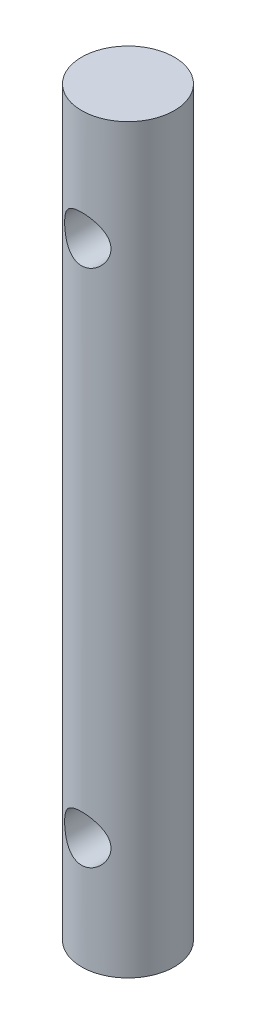
ISO-10303-21;
HEADER;
FILE_DESCRIPTION(('STEP AP214'),'2;1');
FILE_NAME('part.step','',(''),(''),'','','');
FILE_SCHEMA(('AUTOMOTIVE_DESIGN { 1 0 10303 214 1 1 1 1 }'));
ENDSEC;
DATA;
#1=APPLICATION_CONTEXT('core data for automotive mechanical design processes');
#2=APPLICATION_PROTOCOL_DEFINITION('international standard','automotive_design',2000,#1);
#3=PRODUCT_CONTEXT('',#1,'mechanical');
#4=PRODUCT('Part','Part','',(#3));
#5=PRODUCT_RELATED_PRODUCT_CATEGORY('part','',(#4));
#6=PRODUCT_DEFINITION_FORMATION('','',#4);
#7=PRODUCT_DEFINITION_CONTEXT('part definition',#1,'design');
#8=PRODUCT_DEFINITION('design','',#6,#7);
#9=PRODUCT_DEFINITION_SHAPE('','',#8);
#10=(LENGTH_UNIT() NAMED_UNIT(*) SI_UNIT(.MILLI.,.METRE.));
#11=(NAMED_UNIT(*) PLANE_ANGLE_UNIT() SI_UNIT($,.RADIAN.));
#12=(NAMED_UNIT(*) SI_UNIT($,.STERADIAN.) SOLID_ANGLE_UNIT());
#13=UNCERTAINTY_MEASURE_WITH_UNIT(LENGTH_MEASURE(1.E-05),#10,'distance_accuracy_value','');
#14=(GEOMETRIC_REPRESENTATION_CONTEXT(3) GLOBAL_UNCERTAINTY_ASSIGNED_CONTEXT((#13)) GLOBAL_UNIT_ASSIGNED_CONTEXT((#10,
#11,#12)) REPRESENTATION_CONTEXT('',''));
#15=CARTESIAN_POINT('',(0.,0.,0.));
#16=DIRECTION('',(0.,0.,1.));
#17=DIRECTION('',(1.,0.,0.));
#18=AXIS2_PLACEMENT_3D('',#15,#16,#17);
#19=CARTESIAN_POINT('',(0.,50.8,0.));
#20=DIRECTION('',(0.,-1.,0.));
#21=DIRECTION('',(0.,0.,-1.));
#22=AXIS2_PLACEMENT_3D('',#19,#20,#21);
#23=CYLINDRICAL_SURFACE('',#22,3.175);
#24=CARTESIAN_POINT('',(0.,50.8,0.));
#25=DIRECTION('',(0.,1.,0.));
#26=DIRECTION('',(0.,0.,1.));
#27=AXIS2_PLACEMENT_3D('',#24,#25,#26);
#28=CIRCLE('',#27,3.175);
#29=CARTESIAN_POINT('',(0.,50.8,3.175));
#30=VERTEX_POINT('',#29);
#31=EDGE_CURVE('E10',#30,#30,#28,.T.);
#32=ORIENTED_EDGE('',*,*,#31,.F.);
#33=EDGE_LOOP('',(#32));
#34=FACE_BOUND('',#33,.T.);
#35=CARTESIAN_POINT('',(0.,0.,0.));
#36=DIRECTION('',(0.,1.,0.));
#37=DIRECTION('',(0.,0.,1.));
#38=AXIS2_PLACEMENT_3D('',#35,#36,#37);
#39=CIRCLE('',#38,3.175);
#40=CARTESIAN_POINT('',(0.,0.,3.175));
#41=VERTEX_POINT('',#40);
#42=EDGE_CURVE('E42',#41,#41,#39,.T.);
#43=ORIENTED_EDGE('',*,*,#42,.T.);
#44=EDGE_LOOP('',(#43));
#45=FACE_BOUND('',#44,.T.);
#46=CARTESIAN_POINT('',(-1.5875,43.18,2.74963065701559));
#47=CARTESIAN_POINT('',(-1.58749422638082,43.09727885449,2.74963786381429));
#48=CARTESIAN_POINT('',(-1.58099120353898,43.014453259204,2.75342034385563));
#49=CARTESIAN_POINT('',(-1.55531059571316,42.851344217325,2.76800256742633));
#50=CARTESIAN_POINT('',(-1.53610637747976,42.7710664848686,2.77881705563201));
#51=CARTESIAN_POINT('',(-1.48605866856095,42.615720482854,2.8058958773607));
#52=CARTESIAN_POINT('',(-1.4552770495838,42.5406269891982,2.82213119013788));
#53=CARTESIAN_POINT('',(-1.38313719653499,42.3966890793302,2.85817730396762));
#54=CARTESIAN_POINT('',(-1.34177839028179,42.3278450014583,2.87798829843252));
#55=CARTESIAN_POINT('',(-1.24565813309277,42.192089655915,2.92095029628688));
#56=CARTESIAN_POINT('',(-1.19007260737824,42.1258061221182,2.94424201025251));
#57=CARTESIAN_POINT('',(-1.06879041958797,42.0030141834043,2.99040522672308));
#58=CARTESIAN_POINT('',(-1.00308874467939,41.9465106543987,3.01327651457109));
#59=CARTESIAN_POINT('',(-0.858027181920595,41.8411546475531,3.05786594662806));
#60=CARTESIAN_POINT('',(-0.778045162557466,41.793074643523,3.07940243938849));
#61=CARTESIAN_POINT('',(-0.609849279726717,41.7113388954724,3.11706825308002));
#62=CARTESIAN_POINT('',(-0.521640654294325,41.6776740483822,3.1332009850419));
#63=CARTESIAN_POINT('',(-0.346146348482492,41.6282113501845,3.15722732225227));
#64=CARTESIAN_POINT('',(-0.259241592401001,41.6113126269106,3.16562549850666));
#65=CARTESIAN_POINT('',(-0.0834558730578378,41.5922362866034,3.17512039355631));
#66=CARTESIAN_POINT('',(0.00542386177693117,41.5900497623368,3.17622153020536));
#67=CARTESIAN_POINT('',(0.1743591325227,41.6000353449279,3.17123733792365));
#68=CARTESIAN_POINT('',(0.254509903693154,41.6109753496399,3.16576862228805));
#69=CARTESIAN_POINT('',(0.411660612920334,41.6446983396986,3.14919114349849));
#70=CARTESIAN_POINT('',(0.488660314736604,41.6674822112498,3.138081958304));
#71=CARTESIAN_POINT('',(0.638666159116664,41.7243935736676,3.11104888469151));
#72=CARTESIAN_POINT('',(0.711602309830344,41.7586736471606,3.09506050927604));
#73=CARTESIAN_POINT('',(0.850863172402408,41.8373931732199,3.05971013003866));
#74=CARTESIAN_POINT('',(0.917185505031348,41.8818362629925,3.04034691900006));
#75=CARTESIAN_POINT('',(1.04802568667588,41.9844463705587,2.99790476108776));
#76=CARTESIAN_POINT('',(1.11178034410911,42.0435135574675,2.97464759397103));
#77=CARTESIAN_POINT('',(1.22889068784772,42.1712861883266,2.92821265681564));
#78=CARTESIAN_POINT('',(1.28223837337409,42.2399989784851,2.90503496121686));
#79=CARTESIAN_POINT('',(1.38033971874451,42.3904540054732,2.85978847796819));
#80=CARTESIAN_POINT('',(1.42433248752765,42.4727465615985,2.83788357985248));
#81=CARTESIAN_POINT('',(1.49751909188945,42.6449135532824,2.79996027317239));
#82=CARTESIAN_POINT('',(1.52672836990979,42.7347799624154,2.78393572698132));
#83=CARTESIAN_POINT('',(1.56714858500225,42.9120530366614,2.76137109359542));
#84=CARTESIAN_POINT('',(1.57960238136546,42.9990902764816,2.75418003659488));
#85=CARTESIAN_POINT('',(1.58990815274564,43.1742871296575,2.74824696986555));
#86=CARTESIAN_POINT('',(1.5877704422376,43.2624459062277,2.74949899186782));
#87=CARTESIAN_POINT('',(1.57009471880855,43.4271005957437,2.75962009258178));
#88=CARTESIAN_POINT('',(1.55604815903104,43.5038173786338,2.76764095166813));
#89=CARTESIAN_POINT('',(1.517167851854,43.6536588607051,2.78914259212754));
#90=CARTESIAN_POINT('',(1.49233061106499,43.7267823880602,2.80262514157991));
#91=CARTESIAN_POINT('',(1.43136554691026,43.871215487808,2.83426252551455));
#92=CARTESIAN_POINT('',(1.3947680761122,43.942284189255,2.85260483648363));
#93=CARTESIAN_POINT('',(1.31173071412509,44.0776824685681,2.89172839701884));
#94=CARTESIAN_POINT('',(1.2652857668774,44.1420085590773,2.91251089701297));
#95=CARTESIAN_POINT('',(1.15702900292818,44.2705787934436,2.95732197549433));
#96=CARTESIAN_POINT('',(1.09401811980001,44.3337904767643,2.98142950757434));
#97=CARTESIAN_POINT('',(0.957904636444783,44.4490669278148,3.02790598027404));
#98=CARTESIAN_POINT('',(0.884798641015364,44.501127930241,3.05027433199738));
#99=CARTESIAN_POINT('',(0.727924888062026,44.5937857899458,3.09151911684394));
#100=CARTESIAN_POINT('',(0.643926667398903,44.6340438251598,3.11028781154346));
#101=CARTESIAN_POINT('',(0.469141753867716,44.6994564223736,3.1413982599789));
#102=CARTESIAN_POINT('',(0.37836110096008,44.724624246544,3.15374565586242));
#103=CARTESIAN_POINT('',(0.20158024569954,44.7569725956273,3.16972169238739));
#104=CARTESIAN_POINT('',(0.115905667112603,44.7655916279533,3.17404635554253));
#105=CARTESIAN_POINT('',(-0.0557625026975328,44.7688386839089,3.17566881970521));
#106=CARTESIAN_POINT('',(-0.141755971718447,44.7634716052812,3.17296908056188));
#107=CARTESIAN_POINT('',(-0.305654062803469,44.7398514542119,3.16125175530202));
#108=CARTESIAN_POINT('',(-0.383718304525379,44.7224708018034,3.15266220285434));
#109=CARTESIAN_POINT('',(-0.535695449091491,44.6764933886065,3.13042448690684));
#110=CARTESIAN_POINT('',(-0.609607754866868,44.6478950193516,3.11677559798313));
#111=CARTESIAN_POINT('',(-0.754734657413752,44.5790208046865,3.08492415062641));
#112=CARTESIAN_POINT('',(-0.825698664036321,44.5382978244076,3.06655179803093));
#113=CARTESIAN_POINT('',(-0.960079743879763,44.4468917847613,3.02717411362649));
#114=CARTESIAN_POINT('',(-1.02349332927116,44.3962041507789,3.00616757411397));
#115=CARTESIAN_POINT('',(-1.14762598159906,44.2804595418015,2.96114168734771));
#116=CARTESIAN_POINT('',(-1.20744882420609,44.21447455113,2.93703055931071));
#117=CARTESIAN_POINT('',(-1.31550296873904,44.0730469802065,2.89025133408528));
#118=CARTESIAN_POINT('',(-1.36372401564096,43.9975961218725,2.86758452646961));
#119=CARTESIAN_POINT('',(-1.44848433915972,43.8362143235527,2.82574373421554));
#120=CARTESIAN_POINT('',(-1.48460629221299,43.7500275443331,2.80670276631829));
#121=CARTESIAN_POINT('',(-1.54126995134143,43.5715848081106,2.77600023171258));
#122=CARTESIAN_POINT('',(-1.56186376599086,43.4793502888511,2.76431400634477));
#123=CARTESIAN_POINT('',(-1.57855762498476,43.3517589979025,2.75477720255342));
#124=CARTESIAN_POINT('',(-1.58190581663011,43.3175284676433,2.75285404795678));
#125=CARTESIAN_POINT('',(-1.58637828058032,43.2488713369169,2.75027923221803));
#126=CARTESIAN_POINT('',(-1.5875024041098,43.2144447234874,2.74962765613611));
#127=CARTESIAN_POINT('',(-1.5875,43.18,2.74963065701559));
#128=B_SPLINE_CURVE_WITH_KNOTS('',3,(#46,#47,#48,#49,#50,#51,#52,#53,#54,#55,#56,#57,#58,#59,
#60,#61,#62,#63,#64,#65,#66,#67,#68,#69,#70,#71,#72,#73,#74,#75,#76,#77,#78,#79,#80,#81,#82,#83,
#84,#85,#86,#87,#88,#89,#90,#91,#92,#93,#94,#95,#96,#97,#98,#99,#100,#101,#102,#103,#104,#105,
#106,#107,#108,#109,#110,#111,#112,#113,#114,#115,#116,#117,#118,#119,#120,#121,#122,#123,#124,
#125,#126,#127),.UNSPECIFIED.,.T.,.F.,(4,2,2,2,2,2,2,2,2,2,2,2,2,2,2,2,2,2,2,2,2,2,2,2,2,2,2,2,
2,2,2,2,2,2,2,2,2,2,2,2,4),(0.,0.248018494619114,0.496558717359377,0.743789146021224,
0.991032951644172,1.25866892109094,1.52643794096438,1.81225653929037,2.09789437805177,
2.36320782386597,2.62836062601588,2.87045554756704,3.1125685862146,3.35803136385695,
3.60358212718556,3.87234416437813,4.14131201590395,4.42736036245499,4.71310929061081,
4.97621386731061,5.23913247936542,5.4732901618564,5.7075237074225,5.95260583044663,
6.19781409374325,6.47393205434223,6.75014310652896,7.03364387993083,7.31689512946425,
7.5741572924331,7.8313293778543,8.07155524483494,8.3118155695032,8.56235191767161,
8.81300355284891,9.08860008936982,9.36443934266682,9.64899564098785,9.93259273641882,
10.0358596460668,10.1391334633508),.UNSPECIFIED.);
#129=CARTESIAN_POINT('',(-1.5875,43.18,2.74963065701559));
#130=VERTEX_POINT('',#129);
#131=EDGE_CURVE('E50',#130,#130,#128,.T.);
#132=ORIENTED_EDGE('',*,*,#131,.F.);
#133=EDGE_LOOP('',(#132));
#134=FACE_BOUND('',#133,.T.);
#135=CARTESIAN_POINT('',(0.,44.7675,-3.175));
#136=CARTESIAN_POINT('',(0.0834579911850834,44.7674947575714,-3.17499545030503));
#137=CARTESIAN_POINT('',(0.167015477019881,44.7608800089203,-3.17167404493863));
#138=CARTESIAN_POINT('',(0.331660873489373,44.7347135524578,-3.15871472708987));
#139=CARTESIAN_POINT('',(0.412743787657887,44.715137276116,-3.1490648192841));
#140=CARTESIAN_POINT('',(0.569807002497713,44.6640048288211,-3.12445843552858));
#141=CARTESIAN_POINT('',(0.645805799665895,44.6324952150063,-3.10952259694341));
#142=CARTESIAN_POINT('',(0.791325279180476,44.5586316385831,-3.07571420218771));
#143=CARTESIAN_POINT('',(0.860846471709219,44.5162785310049,-3.05684195643221));
#144=CARTESIAN_POINT('',(0.99616866069703,44.4190163664421,-3.01555559984673));
#145=CARTESIAN_POINT('',(1.06149014765635,44.3635027142071,-2.99299628614965));
#146=CARTESIAN_POINT('',(1.18233736872633,44.2427971516953,-2.94735202766705));
#147=CARTESIAN_POINT('',(1.23785563818199,44.1775979353112,-2.92426669731843));
#148=CARTESIAN_POINT('',(1.34183755071481,44.0333076826316,-2.87812085025789));
#149=CARTESIAN_POINT('',(1.38942022018822,43.9535314438759,-2.85520109315084));
#150=CARTESIAN_POINT('',(1.47029206018898,43.7858418541219,-2.81441491301059));
#151=CARTESIAN_POINT('',(1.50359144125906,43.6979343706526,-2.79654488326096));
#152=CARTESIAN_POINT('',(1.55278525197438,43.5218441451427,-2.76951863922521));
#153=CARTESIAN_POINT('',(1.5696022981152,43.433992932343,-2.75990481139145));
#154=CARTESIAN_POINT('',(1.58817785187779,43.2562335950251,-2.74926250293288));
#155=CARTESIAN_POINT('',(1.58995124029225,43.1663275913671,-2.7482255383247));
#156=CARTESIAN_POINT('',(1.57906606838602,42.9985709363994,-2.75448601783382));
#157=CARTESIAN_POINT('',(1.5681079882647,42.9205643504334,-2.76080162313446));
#158=CARTESIAN_POINT('',(1.53501701037788,42.7676914688703,-2.77933513114987));
#159=CARTESIAN_POINT('',(1.51288055293752,42.6928261818278,-2.79155491395445));
#160=CARTESIAN_POINT('',(1.45765802636278,42.546223752052,-2.82078868805226));
#161=CARTESIAN_POINT('',(1.42432891904664,42.4746000919276,-2.83790772054098));
#162=CARTESIAN_POINT('',(1.34785367917295,42.3376180605134,-2.87501654296728));
#163=CARTESIAN_POINT('',(1.30470313705229,42.2722625222349,-2.89500762088553));
#164=CARTESIAN_POINT('',(1.20342986217405,42.1409475112701,-2.93867138171466));
#165=CARTESIAN_POINT('',(1.14410245266124,42.0759622131978,-2.96248947500834));
#166=CARTESIAN_POINT('',(1.01529448125193,41.9564575229869,-3.00906851989396));
#167=CARTESIAN_POINT('',(0.945809094811681,41.9019431326462,-3.03182896234596));
#168=CARTESIAN_POINT('',(0.794569953008063,41.8025490131153,-3.07501904811705));
#169=CARTESIAN_POINT('',(0.712396326664066,41.7582342499924,-3.09529137357186));
#170=CARTESIAN_POINT('',(0.540490117088468,41.6844209663942,-3.12988136279972));
#171=CARTESIAN_POINT('',(0.450763602321127,41.6549106812884,-3.14420375322891));
#172=CARTESIAN_POINT('',(0.274266805511365,41.6139702965998,-3.16427379814529));
#173=CARTESIAN_POINT('',(0.187867179745468,41.601245163252,-3.17063339553329));
#174=CARTESIAN_POINT('',(0.0139376149195961,41.590174739324,-3.17615908866327));
#175=CARTESIAN_POINT('',(-0.0735917690434799,41.5918226365473,-3.17532859220093));
#176=CARTESIAN_POINT('',(-0.240082343027754,41.6087031178647,-3.16692267702328));
#177=CARTESIAN_POINT('',(-0.319181810279264,41.6228728957089,-3.15987502529967));
#178=CARTESIAN_POINT('',(-0.473720941529331,41.6627279391335,-3.14042696962309));
#179=CARTESIAN_POINT('',(-0.5491602010346,41.6884144742449,-3.12802597555879));
#180=CARTESIAN_POINT('',(-0.696735665913697,41.7512475654624,-3.09854999119071));
#181=CARTESIAN_POINT('',(-0.768715755246713,41.7887007920596,-3.08135149809289));
#182=CARTESIAN_POINT('',(-0.905607411697593,41.8736582128389,-3.043935592289));
#183=CARTESIAN_POINT('',(-0.970515949770338,41.9211666886702,-3.02371689462515));
#184=CARTESIAN_POINT('',(-1.09818120674663,42.0302696752125,-2.97986801371214));
#185=CARTESIAN_POINT('',(-1.16010067353771,42.0927893036567,-2.95609779689055));
#186=CARTESIAN_POINT('',(-1.27294690977618,42.2273811776534,-2.90929046679002));
#187=CARTESIAN_POINT('',(-1.3238660748176,42.2994599761711,-2.88625386997575));
#188=CARTESIAN_POINT('',(-1.41558631423544,42.4555343009996,-2.84243767627802));
#189=CARTESIAN_POINT('',(-1.45577797458289,42.539937884925,-2.82182140722634));
#190=CARTESIAN_POINT('',(-1.52095648617134,42.7156722322752,-2.78723839766939));
#191=CARTESIAN_POINT('',(-1.54596292893889,42.8069938982662,-2.77326309427028));
#192=CARTESIAN_POINT('',(-1.57775542885366,42.9845949788295,-2.75528882878461));
#193=CARTESIAN_POINT('',(-1.58606013179365,43.0705168773284,-2.75046096250791));
#194=CARTESIAN_POINT('',(-1.58859403257222,43.2426222191237,-2.74900000493545));
#195=CARTESIAN_POINT('',(-1.5828293315144,43.3288055328714,-2.75236336156894));
#196=CARTESIAN_POINT('',(-1.55880772437938,43.4903300586843,-2.76602606006084));
#197=CARTESIAN_POINT('',(-1.54179319901956,43.5659219963548,-2.7756341249122));
#198=CARTESIAN_POINT('',(-1.49729088118125,43.7130953895862,-2.79988988197899));
#199=CARTESIAN_POINT('',(-1.46979971971638,43.7846755465711,-2.81453919516849));
#200=CARTESIAN_POINT('',(-1.40305749566465,43.9271169509411,-2.848427919537));
#201=CARTESIAN_POINT('',(-1.36314043128242,43.9976067941536,-2.86790959303524));
#202=CARTESIAN_POINT('',(-1.27341466747436,44.1313483261877,-2.90886088970341));
#203=CARTESIAN_POINT('',(-1.22360082184598,44.1945962222023,-2.93033154400532));
#204=CARTESIAN_POINT('',(-1.10839778107493,44.320050396988,-2.97596438013471));
#205=CARTESIAN_POINT('',(-1.04185152150815,44.3811963249811,-3.00013660999272));
#206=CARTESIAN_POINT('',(-0.898770754895197,44.4916924862035,-3.0460593171264));
#207=CARTESIAN_POINT('',(-0.822230898246996,44.5410363614085,-3.06780848569085));
#208=CARTESIAN_POINT('',(-0.660291409892921,44.6265877258054,-3.10670590186878));
#209=CARTESIAN_POINT('',(-0.574832962245556,44.6626998686629,-3.12382053184118));
#210=CARTESIAN_POINT('',(-0.39805308555671,44.7195704663149,-3.15120879312142));
#211=CARTESIAN_POINT('',(-0.306749131847694,44.7403725568041,-3.1615018583887));
#212=CARTESIAN_POINT('',(-0.178755590054295,44.7578121400986,-3.17016545787646));
#213=CARTESIAN_POINT('',(-0.143131983613484,44.7614399423753,-3.17197367477648));
#214=CARTESIAN_POINT('',(-0.0716783742405833,44.7662850315036,-3.17439193950695));
#215=CARTESIAN_POINT('',(-0.0358483656390228,44.7675022518215,-3.17500195426617));
#216=CARTESIAN_POINT('',(0.,44.7675,-3.175));
#217=B_SPLINE_CURVE_WITH_KNOTS('',3,(#135,#136,#137,#138,#139,#140,#141,#142,#143,#144,#145,
#146,#147,#148,#149,#150,#151,#152,#153,#154,#155,#156,#157,#158,#159,#160,#161,#162,#163,#164,
#165,#166,#167,#168,#169,#170,#171,#172,#173,#174,#175,#176,#177,#178,#179,#180,#181,#182,#183,
#184,#185,#186,#187,#188,#189,#190,#191,#192,#193,#194,#195,#196,#197,#198,#199,#200,#201,#202,
#203,#204,#205,#206,#207,#208,#209,#210,#211,#212,#213,#214,#215,#216),.UNSPECIFIED.,.T.,.F.,(4,
2,2,2,2,2,2,2,2,2,2,2,2,2,2,2,2,2,2,2,2,2,2,2,2,2,2,2,2,2,2,2,2,2,2,2,2,2,2,2,4),(0.,
0.250228508654715,0.500932687663351,0.750668671844025,1.00038496992324,1.26520854196496,
1.53023290227578,1.8158099070882,2.10118242288522,2.36947094272614,2.63749404759819,
2.87346568449796,3.10951251232014,3.35105756267473,3.59271127500602,3.86500594367532,
4.13743036175414,4.42250547765424,4.70735369348243,4.96860973623261,5.22974196161968,
5.47063464078468,5.71155388089104,5.95936158944289,6.20727503062988,6.47953381898015,
6.75198021926998,7.03762057931739,7.32289162713402,7.58077775661086,7.83855207535177,
8.07176964270058,8.30506226951507,8.55402875138705,8.80312503315514,9.0824882287701,
9.36200158617728,9.64349121690849,9.92417542436074,10.0316550721259,10.1391376863632),.UNSPECIFIED.);
#218=CARTESIAN_POINT('',(0.,44.7675,-3.175));
#219=VERTEX_POINT('',#218);
#220=EDGE_CURVE('E47',#219,#219,#217,.T.);
#221=ORIENTED_EDGE('',*,*,#220,.F.);
#222=EDGE_LOOP('',(#221));
#223=FACE_BOUND('',#222,.T.);
#224=CARTESIAN_POINT('',(-1.5875,7.62,2.74963065701559));
#225=CARTESIAN_POINT('',(-1.58749422638082,7.53727885449004,2.74963786381429));
#226=CARTESIAN_POINT('',(-1.58099120353898,7.45445325920399,2.75342034385563));
#227=CARTESIAN_POINT('',(-1.55531059571316,7.29134421732502,2.76800256742633));
#228=CARTESIAN_POINT('',(-1.53610637747976,7.21106648486859,2.77881705563201));
#229=CARTESIAN_POINT('',(-1.48605866856095,7.05572048285399,2.8058958773607));
#230=CARTESIAN_POINT('',(-1.4552770495838,6.98062698919818,2.82213119013788));
#231=CARTESIAN_POINT('',(-1.38313719653499,6.83668907933021,2.85817730396762));
#232=CARTESIAN_POINT('',(-1.34177839028179,6.76784500145835,2.87798829843253));
#233=CARTESIAN_POINT('',(-1.24565813309277,6.63208965591496,2.92095029628688));
#234=CARTESIAN_POINT('',(-1.19007260737824,6.56580612211825,2.94424201025251));
#235=CARTESIAN_POINT('',(-1.06879041958797,6.44301418340435,2.99040522672308));
#236=CARTESIAN_POINT('',(-1.00308874467939,6.38651065439866,3.01327651457109));
#237=CARTESIAN_POINT('',(-0.858027181920592,6.28115464755309,3.05786594662807));
#238=CARTESIAN_POINT('',(-0.778045162557463,6.233074643523,3.07940243938849));
#239=CARTESIAN_POINT('',(-0.609849279726714,6.15133889547235,3.11706825308002));
#240=CARTESIAN_POINT('',(-0.521640654294323,6.11767404838224,3.1332009850419));
#241=CARTESIAN_POINT('',(-0.34614634848249,6.06821135018451,3.15722732225227));
#242=CARTESIAN_POINT('',(-0.259241592400999,6.05131262691059,3.16562549850666));
#243=CARTESIAN_POINT('',(-0.0834558730578353,6.03223628660338,3.17512039355631));
#244=CARTESIAN_POINT('',(0.00542386177693352,6.03004976233681,3.17622153020536));
#245=CARTESIAN_POINT('',(0.174359132522702,6.04003534492793,3.17123733792365));
#246=CARTESIAN_POINT('',(0.254509903693155,6.05097534963994,3.16576862228805));
#247=CARTESIAN_POINT('',(0.411660612920335,6.08469833969864,3.14919114349849));
#248=CARTESIAN_POINT('',(0.488660314736605,6.10748221124975,3.138081958304));
#249=CARTESIAN_POINT('',(0.638666159116665,6.16439357366758,3.11104888469151));
#250=CARTESIAN_POINT('',(0.711602309830345,6.19867364716066,3.09506050927604));
#251=CARTESIAN_POINT('',(0.850863172402408,6.27739317321987,3.05971013003866));
#252=CARTESIAN_POINT('',(0.917185505031349,6.32183626299248,3.04034691900006));
#253=CARTESIAN_POINT('',(1.04802568667588,6.42444637055866,2.99790476108776));
#254=CARTESIAN_POINT('',(1.11178034410911,6.48351355746754,2.97464759397103));
#255=CARTESIAN_POINT('',(1.22889068784773,6.61128618832665,2.92821265681563));
#256=CARTESIAN_POINT('',(1.28223837337409,6.67999897848507,2.90503496121686));
#257=CARTESIAN_POINT('',(1.38033971874451,6.83045400547324,2.85978847796819));
#258=CARTESIAN_POINT('',(1.42433248752766,6.91274656159856,2.83788357985248));
#259=CARTESIAN_POINT('',(1.49751909188945,7.08491355328241,2.79996027317239));
#260=CARTESIAN_POINT('',(1.52672836990979,7.17477996241538,2.78393572698132));
#261=CARTESIAN_POINT('',(1.56714858500225,7.35205303666143,2.76137109359542));
#262=CARTESIAN_POINT('',(1.57960238136546,7.43909027648164,2.75418003659488));
#263=CARTESIAN_POINT('',(1.58990815274564,7.61428712965751,2.74824696986555));
#264=CARTESIAN_POINT('',(1.5877704422376,7.70244590622766,2.74949899186782));
#265=CARTESIAN_POINT('',(1.57009471880855,7.86710059574373,2.75962009258178));
#266=CARTESIAN_POINT('',(1.55604815903104,7.94381737863383,2.76764095166813));
#267=CARTESIAN_POINT('',(1.517167851854,8.09365886070515,2.78914259212754));
#268=CARTESIAN_POINT('',(1.49233061106499,8.16678238806024,2.80262514157991));
#269=CARTESIAN_POINT('',(1.43136554691026,8.31121548780803,2.83426252551455));
#270=CARTESIAN_POINT('',(1.3947680761122,8.38228418925501,2.85260483648363));
#271=CARTESIAN_POINT('',(1.31173071412509,8.51768246856815,2.89172839701884));
#272=CARTESIAN_POINT('',(1.26528576687739,8.58200855907734,2.91251089701297));
#273=CARTESIAN_POINT('',(1.15702900292818,8.71057879344363,2.95732197549433));
#274=CARTESIAN_POINT('',(1.09401811980001,8.77379047676428,2.98142950757434));
#275=CARTESIAN_POINT('',(0.957904636444784,8.88906692781482,3.02790598027404));
#276=CARTESIAN_POINT('',(0.884798641015364,8.94112793024098,3.05027433199738));
#277=CARTESIAN_POINT('',(0.727924888062027,9.03378578994579,3.09151911684394));
#278=CARTESIAN_POINT('',(0.643926667398905,9.07404382515982,3.11028781154346));
#279=CARTESIAN_POINT('',(0.469141753867719,9.13945642237361,3.1413982599789));
#280=CARTESIAN_POINT('',(0.37836110096008,9.16462424654401,3.15374565586242));
#281=CARTESIAN_POINT('',(0.201580245699539,9.19697259562727,3.16972169238739));
#282=CARTESIAN_POINT('',(0.115905667112602,9.20559162795333,3.17404635554253));
#283=CARTESIAN_POINT('',(-0.0557625026975339,9.20883868390886,3.17566881970521));
#284=CARTESIAN_POINT('',(-0.141755971718449,9.20347160528116,3.17296908056188));
#285=CARTESIAN_POINT('',(-0.30565406280347,9.17985145421195,3.16125175530202));
#286=CARTESIAN_POINT('',(-0.38371830452538,9.16247080180345,3.15266220285434));
#287=CARTESIAN_POINT('',(-0.535695449091492,9.11649338860653,3.13042448690684));
#288=CARTESIAN_POINT('',(-0.609607754866869,9.08789501935164,3.11677559798313));
#289=CARTESIAN_POINT('',(-0.754734657413754,9.01902080468652,3.08492415062641));
#290=CARTESIAN_POINT('',(-0.825698664036323,8.97829782440756,3.06655179803093));
#291=CARTESIAN_POINT('',(-0.960079743879763,8.88689178476126,3.02717411362649));
#292=CARTESIAN_POINT('',(-1.02349332927116,8.83620415077887,3.00616757411397));
#293=CARTESIAN_POINT('',(-1.14762598159906,8.72045954180146,2.96114168734771));
#294=CARTESIAN_POINT('',(-1.20744882420609,8.65447455112996,2.9370305593107));
#295=CARTESIAN_POINT('',(-1.31550296873905,8.51304698020649,2.89025133408528));
#296=CARTESIAN_POINT('',(-1.36372401564097,8.43759612187255,2.86758452646961));
#297=CARTESIAN_POINT('',(-1.44848433915973,8.27621432355273,2.82574373421554));
#298=CARTESIAN_POINT('',(-1.48460629221299,8.19002754433313,2.80670276631829));
#299=CARTESIAN_POINT('',(-1.54126995134143,8.0115848081106,2.77600023171258));
#300=CARTESIAN_POINT('',(-1.56186376599086,7.91935028885111,2.76431400634477));
#301=CARTESIAN_POINT('',(-1.57855762498476,7.79175899790246,2.75477720255342));
#302=CARTESIAN_POINT('',(-1.58190581663011,7.75752846764336,2.75285404795678));
#303=CARTESIAN_POINT('',(-1.58637828058032,7.68887133691694,2.75027923221803));
#304=CARTESIAN_POINT('',(-1.5875024041098,7.65444472348742,2.74962765613611));
#305=CARTESIAN_POINT('',(-1.5875,7.62,2.74963065701559));
#306=B_SPLINE_CURVE_WITH_KNOTS('',3,(#224,#225,#226,#227,#228,#229,#230,#231,#232,#233,#234,
#235,#236,#237,#238,#239,#240,#241,#242,#243,#244,#245,#246,#247,#248,#249,#250,#251,#252,#253,
#254,#255,#256,#257,#258,#259,#260,#261,#262,#263,#264,#265,#266,#267,#268,#269,#270,#271,#272,
#273,#274,#275,#276,#277,#278,#279,#280,#281,#282,#283,#284,#285,#286,#287,#288,#289,#290,#291,
#292,#293,#294,#295,#296,#297,#298,#299,#300,#301,#302,#303,#304,#305),.UNSPECIFIED.,.T.,.F.,(4,
2,2,2,2,2,2,2,2,2,2,2,2,2,2,2,2,2,2,2,2,2,2,2,2,2,2,2,2,2,2,2,2,2,2,2,2,2,2,2,4),(0.,
0.248018494619111,0.496558717359377,0.743789146021232,0.991032951644175,1.25866892109095,
1.52643794096439,1.81225653929037,2.09789437805177,2.36320782386597,2.62836062601588,
2.87045554756704,3.1125685862146,3.35803136385695,3.60358212718556,3.87234416437814,
4.14131201590396,4.42736036245499,4.71310929061081,4.97621386731061,5.23913247936542,
5.47329016185641,5.7075237074225,5.95260583044664,6.19781409374325,6.47393205434223,
6.75014310652896,7.03364387993083,7.31689512946425,7.5741572924331,7.8313293778543,
8.07155524483494,8.3118155695032,8.56235191767162,8.81300355284891,9.08860008936982,
9.36443934266682,9.64899564098786,9.93259273641882,10.0358596460668,10.1391334633508),.UNSPECIFIED.);
#307=CARTESIAN_POINT('',(-1.5875,7.62,2.74963065701559));
#308=VERTEX_POINT('',#307);
#309=EDGE_CURVE('E88',#308,#308,#306,.T.);
#310=ORIENTED_EDGE('',*,*,#309,.F.);
#311=EDGE_LOOP('',(#310));
#312=FACE_BOUND('',#311,.T.);
#313=CARTESIAN_POINT('',(0.,9.2075,-3.175));
#314=CARTESIAN_POINT('',(0.0834579911850829,9.20749475757146,-3.17499545030503));
#315=CARTESIAN_POINT('',(0.16701547701988,9.20088000892032,-3.17167404493863));
#316=CARTESIAN_POINT('',(0.331660873489372,9.17471355245781,-3.15871472708987));
#317=CARTESIAN_POINT('',(0.412743787657887,9.15513727611597,-3.1490648192841));
#318=CARTESIAN_POINT('',(0.569807002497713,9.1040048288211,-3.12445843552858));
#319=CARTESIAN_POINT('',(0.645805799665895,9.07249521500635,-3.10952259694341));
#320=CARTESIAN_POINT('',(0.791325279180475,8.99863163858309,-3.07571420218771));
#321=CARTESIAN_POINT('',(0.860846471709219,8.95627853100493,-3.05684195643221));
#322=CARTESIAN_POINT('',(0.99616866069703,8.85901636644211,-3.01555559984673));
#323=CARTESIAN_POINT('',(1.06149014765635,8.80350271420707,-2.99299628614965));
#324=CARTESIAN_POINT('',(1.18233736872633,8.68279715169533,-2.94735202766705));
#325=CARTESIAN_POINT('',(1.23785563818199,8.61759793531125,-2.92426669731842));
#326=CARTESIAN_POINT('',(1.34183755071482,8.47330768263163,-2.87812085025789));
#327=CARTESIAN_POINT('',(1.38942022018822,8.39353144387586,-2.85520109315084));
#328=CARTESIAN_POINT('',(1.47029206018898,8.22584185412188,-2.81441491301059));
#329=CARTESIAN_POINT('',(1.50359144125905,8.13793437065264,-2.79654488326096));
#330=CARTESIAN_POINT('',(1.55278525197438,7.9618441451427,-2.76951863922521));
#331=CARTESIAN_POINT('',(1.5696022981152,7.87399293234301,-2.75990481139145));
#332=CARTESIAN_POINT('',(1.58817785187779,7.69623359502508,-2.74926250293288));
#333=CARTESIAN_POINT('',(1.58995124029225,7.60632759136704,-2.7482255383247));
#334=CARTESIAN_POINT('',(1.57906606838602,7.43857093639935,-2.75448601783382));
#335=CARTESIAN_POINT('',(1.5681079882647,7.36056435043341,-2.76080162313446));
#336=CARTESIAN_POINT('',(1.53501701037788,7.20769146887029,-2.77933513114987));
#337=CARTESIAN_POINT('',(1.51288055293752,7.13282618182781,-2.79155491395445));
#338=CARTESIAN_POINT('',(1.45765802636278,6.98622375205202,-2.82078868805226));
#339=CARTESIAN_POINT('',(1.42432891904664,6.91460009192756,-2.83790772054098));
#340=CARTESIAN_POINT('',(1.34785367917295,6.77761806051336,-2.87501654296728));
#341=CARTESIAN_POINT('',(1.30470313705229,6.71226252223486,-2.89500762088552));
#342=CARTESIAN_POINT('',(1.20342986217405,6.58094751127013,-2.93867138171466));
#343=CARTESIAN_POINT('',(1.14410245266124,6.51596221319785,-2.96248947500834));
#344=CARTESIAN_POINT('',(1.01529448125193,6.39645752298694,-3.00906851989396));
#345=CARTESIAN_POINT('',(0.945809094811678,6.34194313264621,-3.03182896234596));
#346=CARTESIAN_POINT('',(0.794569953008059,6.24254901311531,-3.07501904811705));
#347=CARTESIAN_POINT('',(0.712396326664061,6.19823424999239,-3.09529137357186));
#348=CARTESIAN_POINT('',(0.540490117088464,6.12442096639422,-3.12988136279972));
#349=CARTESIAN_POINT('',(0.450763602321125,6.09491068128842,-3.14420375322891));
#350=CARTESIAN_POINT('',(0.274266805511364,6.05397029659978,-3.16427379814529));
#351=CARTESIAN_POINT('',(0.187867179745467,6.04124516325198,-3.1706333955333));
#352=CARTESIAN_POINT('',(0.0139376149195953,6.030174739324,-3.17615908866327));
#353=CARTESIAN_POINT('',(-0.0735917690434803,6.03182263654734,-3.17532859220093));
#354=CARTESIAN_POINT('',(-0.240082343027754,6.04870311786476,-3.16692267702328));
#355=CARTESIAN_POINT('',(-0.319181810279264,6.06287289570886,-3.15987502529967));
#356=CARTESIAN_POINT('',(-0.473720941529331,6.1027279391335,-3.14042696962309));
#357=CARTESIAN_POINT('',(-0.549160201034601,6.12841447424492,-3.12802597555879));
#358=CARTESIAN_POINT('',(-0.696735665913697,6.19124756546244,-3.09854999119071));
#359=CARTESIAN_POINT('',(-0.768715755246713,6.2287007920596,-3.08135149809289));
#360=CARTESIAN_POINT('',(-0.905607411697593,6.31365821283893,-3.043935592289));
#361=CARTESIAN_POINT('',(-0.970515949770339,6.36116668867019,-3.02371689462514));
#362=CARTESIAN_POINT('',(-1.09818120674663,6.47026967521251,-2.97986801371214));
#363=CARTESIAN_POINT('',(-1.1601006735377,6.53278930365667,-2.95609779689055));
#364=CARTESIAN_POINT('',(-1.27294690977618,6.66738117765339,-2.90929046679002));
#365=CARTESIAN_POINT('',(-1.3238660748176,6.73945997617107,-2.88625386997575));
#366=CARTESIAN_POINT('',(-1.41558631423544,6.8955343009996,-2.84243767627802));
#367=CARTESIAN_POINT('',(-1.45577797458289,6.97993788492499,-2.82182140722634));
#368=CARTESIAN_POINT('',(-1.52095648617134,7.15567223227526,-2.78723839766939));
#369=CARTESIAN_POINT('',(-1.54596292893889,7.24699389826619,-2.77326309427028));
#370=CARTESIAN_POINT('',(-1.57775542885366,7.42459497882947,-2.75528882878461));
#371=CARTESIAN_POINT('',(-1.58606013179365,7.51051687732845,-2.75046096250791));
#372=CARTESIAN_POINT('',(-1.58859403257222,7.68262221912368,-2.74900000493545));
#373=CARTESIAN_POINT('',(-1.5828293315144,7.76880553287136,-2.75236336156894));
#374=CARTESIAN_POINT('',(-1.55880772437938,7.93033005868433,-2.76602606006084));
#375=CARTESIAN_POINT('',(-1.54179319901957,8.00592199635477,-2.7756341249122));
#376=CARTESIAN_POINT('',(-1.49729088118125,8.15309538958618,-2.79988988197899));
#377=CARTESIAN_POINT('',(-1.46979971971637,8.2246755465711,-2.81453919516849));
#378=CARTESIAN_POINT('',(-1.40305749566465,8.36711695094113,-2.848427919537));
#379=CARTESIAN_POINT('',(-1.36314043128242,8.43760679415358,-2.86790959303524));
#380=CARTESIAN_POINT('',(-1.27341466747436,8.57134832618775,-2.90886088970341));
#381=CARTESIAN_POINT('',(-1.22360082184598,8.63459622220227,-2.93033154400532));
#382=CARTESIAN_POINT('',(-1.10839778107493,8.76005039698805,-2.97596438013471));
#383=CARTESIAN_POINT('',(-1.04185152150815,8.82119632498109,-3.00013660999272));
#384=CARTESIAN_POINT('',(-0.8987707548952,8.93169248620349,-3.0460593171264));
#385=CARTESIAN_POINT('',(-0.822230898247,8.98103636140848,-3.06780848569085));
#386=CARTESIAN_POINT('',(-0.660291409892926,9.06658772580541,-3.10670590186878));
#387=CARTESIAN_POINT('',(-0.574832962245559,9.10269986866289,-3.12382053184118));
#388=CARTESIAN_POINT('',(-0.398053085556712,9.15957046631488,-3.15120879312142));
#389=CARTESIAN_POINT('',(-0.306749131847695,9.18037255680407,-3.1615018583887));
#390=CARTESIAN_POINT('',(-0.178755590054295,9.19781214009861,-3.17016545787646));
#391=CARTESIAN_POINT('',(-0.143131983613483,9.20143994237531,-3.17197367477648));
#392=CARTESIAN_POINT('',(-0.0716783742405818,9.20628503150361,-3.17439193950695));
#393=CARTESIAN_POINT('',(-0.0358483656390221,9.20750225182146,-3.17500195426617));
#394=CARTESIAN_POINT('',(0.,9.2075,-3.175));
#395=B_SPLINE_CURVE_WITH_KNOTS('',3,(#313,#314,#315,#316,#317,#318,#319,#320,#321,#322,#323,
#324,#325,#326,#327,#328,#329,#330,#331,#332,#333,#334,#335,#336,#337,#338,#339,#340,#341,#342,
#343,#344,#345,#346,#347,#348,#349,#350,#351,#352,#353,#354,#355,#356,#357,#358,#359,#360,#361,
#362,#363,#364,#365,#366,#367,#368,#369,#370,#371,#372,#373,#374,#375,#376,#377,#378,#379,#380,
#381,#382,#383,#384,#385,#386,#387,#388,#389,#390,#391,#392,#393,#394),.UNSPECIFIED.,.T.,.F.,(4,
2,2,2,2,2,2,2,2,2,2,2,2,2,2,2,2,2,2,2,2,2,2,2,2,2,2,2,2,2,2,2,2,2,2,2,2,2,2,2,4),(0.,
0.250228508654714,0.500932687663351,0.750668671844024,1.00038496992324,1.26520854196496,
1.53023290227578,1.8158099070882,2.10118242288521,2.36947094272614,2.6374940475982,
2.87346568449796,3.10951251232015,3.35105756267474,3.59271127500602,3.86500594367532,
4.13743036175415,4.42250547765425,4.70735369348244,4.96860973623261,5.22974196161968,
5.47063464078469,5.71155388089104,5.95936158944289,6.20727503062989,6.47953381898015,
6.75198021926998,7.0376205793174,7.32289162713403,7.58077775661087,7.83855207535177,
8.07176964270058,8.30506226951507,8.55402875138706,8.80312503315514,9.0824882287701,
9.36200158617728,9.64349121690848,9.92417542436075,10.0316550721259,10.1391376863632),.UNSPECIFIED.);
#396=CARTESIAN_POINT('',(0.,9.2075,-3.175));
#397=VERTEX_POINT('',#396);
#398=EDGE_CURVE('E35',#397,#397,#395,.T.);
#399=ORIENTED_EDGE('',*,*,#398,.F.);
#400=EDGE_LOOP('',(#399));
#401=FACE_BOUND('',#400,.T.);
#402=ADVANCED_FACE('F31',(#34,#45,#134,#223,#312,#401),#23,.T.);
#403=CARTESIAN_POINT('',(0.,50.8,0.));
#404=DIRECTION('',(0.,1.,0.));
#405=DIRECTION('',(0.,0.,1.));
#406=AXIS2_PLACEMENT_3D('',#403,#404,#405);
#407=PLANE('',#406);
#408=ORIENTED_EDGE('',*,*,#31,.T.);
#409=EDGE_LOOP('',(#408));
#410=FACE_BOUND('',#409,.T.);
#411=ADVANCED_FACE('F66',(#410),#407,.T.);
#412=CARTESIAN_POINT('',(0.,0.,0.));
#413=DIRECTION('',(0.,1.,0.));
#414=DIRECTION('',(0.,0.,1.));
#415=AXIS2_PLACEMENT_3D('',#412,#413,#414);
#416=PLANE('',#415);
#417=ORIENTED_EDGE('',*,*,#42,.F.);
#418=EDGE_LOOP('',(#417));
#419=FACE_BOUND('',#418,.T.);
#420=ADVANCED_FACE('F63',(#419),#416,.F.);
#421=CARTESIAN_POINT('',(0.,43.18,12.192));
#422=DIRECTION('',(0.,0.,-1.));
#423=DIRECTION('',(-1.,0.,0.));
#424=AXIS2_PLACEMENT_3D('',#421,#422,#423);
#425=CYLINDRICAL_SURFACE('',#424,1.5875);
#426=ORIENTED_EDGE('',*,*,#131,.T.);
#427=EDGE_LOOP('',(#426));
#428=FACE_BOUND('',#427,.T.);
#429=ORIENTED_EDGE('',*,*,#220,.T.);
#430=EDGE_LOOP('',(#429));
#431=FACE_BOUND('',#430,.T.);
#432=ADVANCED_FACE('F58',(#428,#431),#425,.F.);
#433=CARTESIAN_POINT('',(0.,7.62,11.176));
#434=DIRECTION('',(0.,0.,-1.));
#435=DIRECTION('',(-1.,0.,0.));
#436=AXIS2_PLACEMENT_3D('',#433,#434,#435);
#437=CYLINDRICAL_SURFACE('',#436,1.5875);
#438=ORIENTED_EDGE('',*,*,#309,.T.);
#439=EDGE_LOOP('',(#438));
#440=FACE_BOUND('',#439,.T.);
#441=ORIENTED_EDGE('',*,*,#398,.T.);
#442=EDGE_LOOP('',(#441));
#443=FACE_BOUND('',#442,.T.);
#444=ADVANCED_FACE('F62',(#440,#443),#437,.F.);
#445=CLOSED_SHELL('',(#402,#411,#420,#432,#444));
#446=MANIFOLD_SOLID_BREP('B2',#445);
#447=ADVANCED_BREP_SHAPE_REPRESENTATION('',(#18,#446),#14);
#448=SHAPE_DEFINITION_REPRESENTATION(#9,#447);
ENDSEC;
END-ISO-10303-21;
